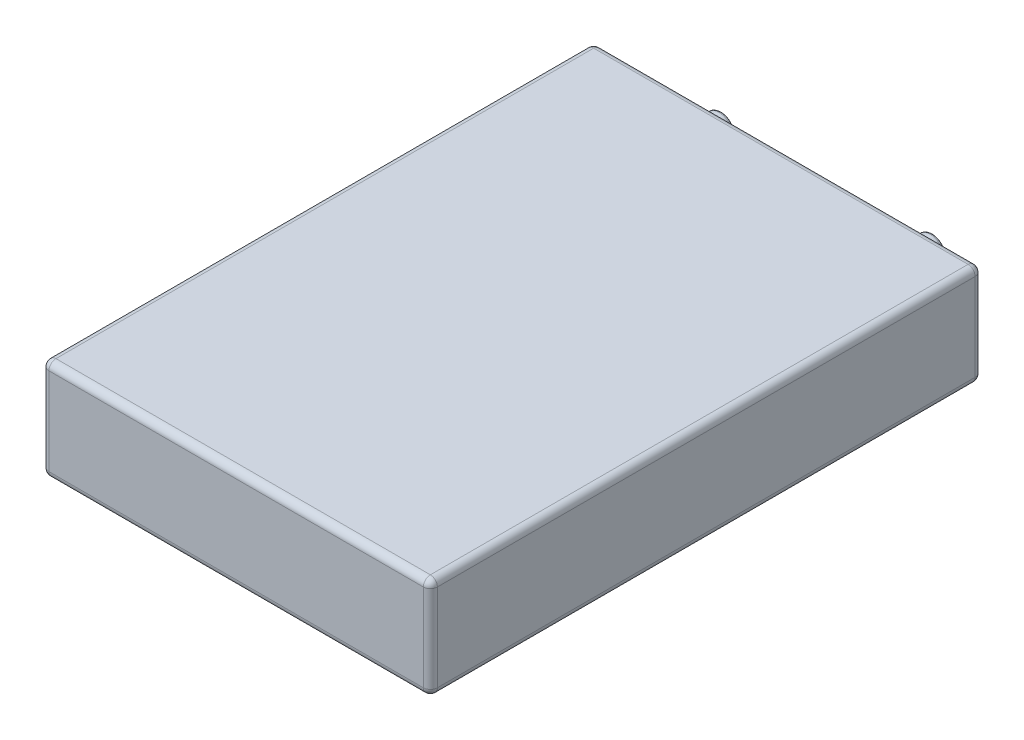
ISO-10303-21;
HEADER;
FILE_DESCRIPTION(('STEP AP214'),'2;1');
FILE_NAME('part.step','',(''),(''),'','','');
FILE_SCHEMA(('AUTOMOTIVE_DESIGN { 1 0 10303 214 1 1 1 1 }'));
ENDSEC;
DATA;
#1=APPLICATION_CONTEXT('core data for automotive mechanical design processes');
#2=APPLICATION_PROTOCOL_DEFINITION('international standard','automotive_design',2000,#1);
#3=PRODUCT_CONTEXT('',#1,'mechanical');
#4=PRODUCT('Part','Part','',(#3));
#5=PRODUCT_RELATED_PRODUCT_CATEGORY('part','',(#4));
#6=PRODUCT_DEFINITION_FORMATION('','',#4);
#7=PRODUCT_DEFINITION_CONTEXT('part definition',#1,'design');
#8=PRODUCT_DEFINITION('design','',#6,#7);
#9=PRODUCT_DEFINITION_SHAPE('','',#8);
#10=(LENGTH_UNIT() NAMED_UNIT(*) SI_UNIT(.MILLI.,.METRE.));
#11=(NAMED_UNIT(*) PLANE_ANGLE_UNIT() SI_UNIT($,.RADIAN.));
#12=(NAMED_UNIT(*) SI_UNIT($,.STERADIAN.) SOLID_ANGLE_UNIT());
#13=UNCERTAINTY_MEASURE_WITH_UNIT(LENGTH_MEASURE(1.E-05),#10,'distance_accuracy_value','');
#14=(GEOMETRIC_REPRESENTATION_CONTEXT(3) GLOBAL_UNCERTAINTY_ASSIGNED_CONTEXT((#13)) GLOBAL_UNIT_ASSIGNED_CONTEXT((#10,
#11,#12)) REPRESENTATION_CONTEXT('',''));
#15=CARTESIAN_POINT('',(0.,0.,0.));
#16=DIRECTION('',(0.,0.,1.));
#17=DIRECTION('',(1.,0.,0.));
#18=AXIS2_PLACEMENT_3D('',#15,#16,#17);
#19=CARTESIAN_POINT('',(-66.5,36.,95.5));
#20=DIRECTION('',(0.,-1.,0.));
#21=DIRECTION('',(0.,0.,-1.));
#22=AXIS2_PLACEMENT_3D('',#19,#20,#21);
#23=CYLINDRICAL_SURFACE('',#22,2.5);
#24=DIRECTION('',(0.,-1.,0.));
#25=VECTOR('',#24,1.);
#26=CARTESIAN_POINT('',(-69.,36.,95.5));
#27=LINE('',#26,#25);
#28=CARTESIAN_POINT('',(-69.,33.5,95.5));
#29=VERTEX_POINT('',#28);
#30=CARTESIAN_POINT('',(-69.,2.5,95.5));
#31=VERTEX_POINT('',#30);
#32=EDGE_CURVE('E229',#29,#31,#27,.T.);
#33=ORIENTED_EDGE('',*,*,#32,.T.);
#34=CARTESIAN_POINT('',(-66.5,2.5,95.5));
#35=DIRECTION('',(0.,-1.,0.));
#36=DIRECTION('',(0.,0.,-1.));
#37=AXIS2_PLACEMENT_3D('',#34,#35,#36);
#38=CIRCLE('',#37,2.5);
#39=CARTESIAN_POINT('',(-66.5,2.5,98.));
#40=VERTEX_POINT('',#39);
#41=EDGE_CURVE('E197',#31,#40,#38,.F.);
#42=ORIENTED_EDGE('',*,*,#41,.T.);
#43=DIRECTION('',(0.,-1.,0.));
#44=VECTOR('',#43,1.);
#45=CARTESIAN_POINT('',(-66.5,36.,98.));
#46=LINE('',#45,#44);
#47=CARTESIAN_POINT('',(-66.5,33.5,98.));
#48=VERTEX_POINT('',#47);
#49=EDGE_CURVE('E145',#48,#40,#46,.T.);
#50=ORIENTED_EDGE('',*,*,#49,.F.);
#51=CARTESIAN_POINT('',(-66.5,33.5,95.5));
#52=DIRECTION('',(0.,-1.,0.));
#53=DIRECTION('',(0.,0.,-1.));
#54=AXIS2_PLACEMENT_3D('',#51,#52,#53);
#55=CIRCLE('',#54,2.5);
#56=EDGE_CURVE('E195',#48,#29,#55,.T.);
#57=ORIENTED_EDGE('',*,*,#56,.T.);
#58=EDGE_LOOP('',(#33,#42,#50,#57));
#59=FACE_BOUND('',#58,.T.);
#60=ADVANCED_FACE('F33',(#59),#23,.T.);
#61=CARTESIAN_POINT('',(66.5,36.,98.));
#62=DIRECTION('',(0.,0.,-1.));
#63=DIRECTION('',(-1.,0.,0.));
#64=AXIS2_PLACEMENT_3D('',#61,#62,#63);
#65=PLANE('',#64);
#66=ORIENTED_EDGE('',*,*,#49,.T.);
#67=DIRECTION('',(1.,0.,0.));
#68=VECTOR('',#67,1.);
#69=CARTESIAN_POINT('',(66.5,2.5,98.));
#70=LINE('',#69,#68);
#71=CARTESIAN_POINT('',(66.5,2.5,98.));
#72=VERTEX_POINT('',#71);
#73=EDGE_CURVE('E144',#40,#72,#70,.T.);
#74=ORIENTED_EDGE('',*,*,#73,.T.);
#75=DIRECTION('',(0.,-1.,0.));
#76=VECTOR('',#75,1.);
#77=CARTESIAN_POINT('',(66.5,36.,98.));
#78=LINE('',#77,#76);
#79=CARTESIAN_POINT('',(66.5,33.5,98.));
#80=VERTEX_POINT('',#79);
#81=EDGE_CURVE('E126',#80,#72,#78,.T.);
#82=ORIENTED_EDGE('',*,*,#81,.F.);
#83=DIRECTION('',(1.,0.,0.));
#84=VECTOR('',#83,1.);
#85=CARTESIAN_POINT('',(66.5,33.5,98.));
#86=LINE('',#85,#84);
#87=EDGE_CURVE('E141',#80,#48,#86,.F.);
#88=ORIENTED_EDGE('',*,*,#87,.T.);
#89=EDGE_LOOP('',(#66,#74,#82,#88));
#90=FACE_BOUND('',#89,.T.);
#91=ADVANCED_FACE('F139',(#90),#65,.F.);
#92=CARTESIAN_POINT('',(66.5,36.,95.5));
#93=DIRECTION('',(0.,-1.,0.));
#94=DIRECTION('',(0.,0.,-1.));
#95=AXIS2_PLACEMENT_3D('',#92,#93,#94);
#96=CYLINDRICAL_SURFACE('',#95,2.5);
#97=ORIENTED_EDGE('',*,*,#81,.T.);
#98=CARTESIAN_POINT('',(66.5,2.5,95.5));
#99=DIRECTION('',(0.,-1.,0.));
#100=DIRECTION('',(0.,0.,-1.));
#101=AXIS2_PLACEMENT_3D('',#98,#99,#100);
#102=CIRCLE('',#101,2.5);
#103=CARTESIAN_POINT('',(69.,2.5,95.4999999999999));
#104=VERTEX_POINT('',#103);
#105=EDGE_CURVE('E133',#72,#104,#102,.F.);
#106=ORIENTED_EDGE('',*,*,#105,.T.);
#107=DIRECTION('',(0.,-1.,0.));
#108=VECTOR('',#107,1.);
#109=CARTESIAN_POINT('',(69.,36.,95.4999999999999));
#110=LINE('',#109,#108);
#111=CARTESIAN_POINT('',(69.,33.5,95.4999999999999));
#112=VERTEX_POINT('',#111);
#113=EDGE_CURVE('E128',#112,#104,#110,.T.);
#114=ORIENTED_EDGE('',*,*,#113,.F.);
#115=CARTESIAN_POINT('',(66.5,33.5,95.5));
#116=DIRECTION('',(0.,-1.,0.));
#117=DIRECTION('',(0.,0.,-1.));
#118=AXIS2_PLACEMENT_3D('',#115,#116,#117);
#119=CIRCLE('',#118,2.5);
#120=EDGE_CURVE('E123',#112,#80,#119,.T.);
#121=ORIENTED_EDGE('',*,*,#120,.T.);
#122=EDGE_LOOP('',(#97,#106,#114,#121));
#123=FACE_BOUND('',#122,.T.);
#124=ADVANCED_FACE('F125',(#123),#96,.T.);
#125=CARTESIAN_POINT('',(69.,36.,95.4999999999999));
#126=DIRECTION('',(-1.,0.,0.));
#127=DIRECTION('',(0.,0.,1.));
#128=AXIS2_PLACEMENT_3D('',#125,#126,#127);
#129=PLANE('',#128);
#130=ORIENTED_EDGE('',*,*,#113,.T.);
#131=DIRECTION('',(0.,0.,-1.));
#132=VECTOR('',#131,1.);
#133=CARTESIAN_POINT('',(69.,2.5,-95.5));
#134=LINE('',#133,#132);
#135=CARTESIAN_POINT('',(69.,2.5,-95.5));
#136=VERTEX_POINT('',#135);
#137=EDGE_CURVE('E176',#104,#136,#134,.T.);
#138=ORIENTED_EDGE('',*,*,#137,.T.);
#139=DIRECTION('',(0.,-1.,0.));
#140=VECTOR('',#139,1.);
#141=CARTESIAN_POINT('',(69.,36.,-95.5));
#142=LINE('',#141,#140);
#143=CARTESIAN_POINT('',(69.,33.5,-95.5));
#144=VERTEX_POINT('',#143);
#145=EDGE_CURVE('E645',#144,#136,#142,.T.);
#146=ORIENTED_EDGE('',*,*,#145,.F.);
#147=DIRECTION('',(0.,0.,-1.));
#148=VECTOR('',#147,1.);
#149=CARTESIAN_POINT('',(69.,33.5,95.4999999999999));
#150=LINE('',#149,#148);
#151=EDGE_CURVE('E174',#144,#112,#150,.F.);
#152=ORIENTED_EDGE('',*,*,#151,.T.);
#153=EDGE_LOOP('',(#130,#138,#146,#152));
#154=FACE_BOUND('',#153,.T.);
#155=ADVANCED_FACE('F416',(#154),#129,.F.);
#156=CARTESIAN_POINT('',(66.5,36.,-95.5));
#157=DIRECTION('',(0.,-1.,0.));
#158=DIRECTION('',(0.,0.,-1.));
#159=AXIS2_PLACEMENT_3D('',#156,#157,#158);
#160=CYLINDRICAL_SURFACE('',#159,2.5);
#161=ORIENTED_EDGE('',*,*,#145,.T.);
#162=CARTESIAN_POINT('',(66.5,2.5,-95.5));
#163=DIRECTION('',(0.,-1.,0.));
#164=DIRECTION('',(0.,0.,-1.));
#165=AXIS2_PLACEMENT_3D('',#162,#163,#164);
#166=CIRCLE('',#165,2.5);
#167=CARTESIAN_POINT('',(66.5,2.5,-98.));
#168=VERTEX_POINT('',#167);
#169=EDGE_CURVE('E180',#136,#168,#166,.F.);
#170=ORIENTED_EDGE('',*,*,#169,.T.);
#171=DIRECTION('',(0.,-1.,0.));
#172=VECTOR('',#171,1.);
#173=CARTESIAN_POINT('',(66.5,36.,-98.));
#174=LINE('',#173,#172);
#175=CARTESIAN_POINT('',(66.5,33.5,-98.));
#176=VERTEX_POINT('',#175);
#177=EDGE_CURVE('E662',#176,#168,#174,.T.);
#178=ORIENTED_EDGE('',*,*,#177,.F.);
#179=CARTESIAN_POINT('',(66.5,33.5,-95.5));
#180=DIRECTION('',(0.,-1.,0.));
#181=DIRECTION('',(0.,0.,-1.));
#182=AXIS2_PLACEMENT_3D('',#179,#180,#181);
#183=CIRCLE('',#182,2.5);
#184=EDGE_CURVE('E178',#176,#144,#183,.T.);
#185=ORIENTED_EDGE('',*,*,#184,.T.);
#186=EDGE_LOOP('',(#161,#170,#178,#185));
#187=FACE_BOUND('',#186,.T.);
#188=ADVANCED_FACE('F412',(#187),#160,.T.);
#189=CARTESIAN_POINT('',(66.5,36.,-98.));
#190=DIRECTION('',(0.,0.,1.));
#191=DIRECTION('',(1.,0.,0.));
#192=AXIS2_PLACEMENT_3D('',#189,#190,#191);
#193=PLANE('',#192);
#194=CARTESIAN_POINT('',(-37.5,18.,-98.));
#195=DIRECTION('',(0.,0.,1.));
#196=DIRECTION('',(1.,0.,0.));
#197=AXIS2_PLACEMENT_3D('',#194,#195,#196);
#198=CIRCLE('',#197,10.);
#199=CARTESIAN_POINT('',(-27.5,18.,-98.));
#200=VERTEX_POINT('',#199);
#201=EDGE_CURVE('E244',#200,#200,#198,.F.);
#202=ORIENTED_EDGE('',*,*,#201,.F.);
#203=EDGE_LOOP('',(#202));
#204=FACE_BOUND('',#203,.T.);
#205=CARTESIAN_POINT('',(37.5,18.,-98.));
#206=DIRECTION('',(0.,0.,1.));
#207=DIRECTION('',(1.,0.,0.));
#208=AXIS2_PLACEMENT_3D('',#205,#206,#207);
#209=CIRCLE('',#208,10.);
#210=CARTESIAN_POINT('',(47.5,18.,-98.));
#211=VERTEX_POINT('',#210);
#212=EDGE_CURVE('E205',#211,#211,#209,.F.);
#213=ORIENTED_EDGE('',*,*,#212,.F.);
#214=EDGE_LOOP('',(#213));
#215=FACE_BOUND('',#214,.T.);
#216=ORIENTED_EDGE('',*,*,#177,.T.);
#217=DIRECTION('',(-1.,0.,0.));
#218=VECTOR('',#217,1.);
#219=CARTESIAN_POINT('',(-66.5,2.5,-98.));
#220=LINE('',#219,#218);
#221=CARTESIAN_POINT('',(-66.5,2.5,-98.));
#222=VERTEX_POINT('',#221);
#223=EDGE_CURVE('E184',#168,#222,#220,.T.);
#224=ORIENTED_EDGE('',*,*,#223,.T.);
#225=DIRECTION('',(0.,-1.,0.));
#226=VECTOR('',#225,1.);
#227=CARTESIAN_POINT('',(-66.5,36.,-98.));
#228=LINE('',#227,#226);
#229=CARTESIAN_POINT('',(-66.5,33.5,-98.));
#230=VERTEX_POINT('',#229);
#231=EDGE_CURVE('E668',#230,#222,#228,.T.);
#232=ORIENTED_EDGE('',*,*,#231,.F.);
#233=DIRECTION('',(-1.,0.,0.));
#234=VECTOR('',#233,1.);
#235=CARTESIAN_POINT('',(66.5,33.5,-98.));
#236=LINE('',#235,#234);
#237=EDGE_CURVE('E182',#230,#176,#236,.F.);
#238=ORIENTED_EDGE('',*,*,#237,.T.);
#239=EDGE_LOOP('',(#216,#224,#232,#238));
#240=FACE_BOUND('',#239,.T.);
#241=ADVANCED_FACE('F408',(#204,#215,#240),#193,.F.);
#242=CARTESIAN_POINT('',(-66.5,36.,-95.5));
#243=DIRECTION('',(0.,-1.,0.));
#244=DIRECTION('',(0.,0.,-1.));
#245=AXIS2_PLACEMENT_3D('',#242,#243,#244);
#246=CYLINDRICAL_SURFACE('',#245,2.5);
#247=ORIENTED_EDGE('',*,*,#231,.T.);
#248=CARTESIAN_POINT('',(-66.5,2.5,-95.5));
#249=DIRECTION('',(0.,-1.,0.));
#250=DIRECTION('',(0.,0.,-1.));
#251=AXIS2_PLACEMENT_3D('',#248,#249,#250);
#252=CIRCLE('',#251,2.5);
#253=CARTESIAN_POINT('',(-69.,2.5,-95.5));
#254=VERTEX_POINT('',#253);
#255=EDGE_CURVE('E188',#222,#254,#252,.F.);
#256=ORIENTED_EDGE('',*,*,#255,.T.);
#257=DIRECTION('',(0.,-1.,0.));
#258=VECTOR('',#257,1.);
#259=CARTESIAN_POINT('',(-69.,36.,-95.5));
#260=LINE('',#259,#258);
#261=CARTESIAN_POINT('',(-69.,33.5,-95.5));
#262=VERTEX_POINT('',#261);
#263=EDGE_CURVE('E671',#262,#254,#260,.T.);
#264=ORIENTED_EDGE('',*,*,#263,.F.);
#265=CARTESIAN_POINT('',(-66.5,33.5,-95.5));
#266=DIRECTION('',(0.,-1.,0.));
#267=DIRECTION('',(0.,0.,-1.));
#268=AXIS2_PLACEMENT_3D('',#265,#266,#267);
#269=CIRCLE('',#268,2.5);
#270=EDGE_CURVE('E186',#262,#230,#269,.T.);
#271=ORIENTED_EDGE('',*,*,#270,.T.);
#272=EDGE_LOOP('',(#247,#256,#264,#271));
#273=FACE_BOUND('',#272,.T.);
#274=ADVANCED_FACE('F404',(#273),#246,.T.);
#275=CARTESIAN_POINT('',(-69.,36.,95.5));
#276=DIRECTION('',(1.,0.,0.));
#277=DIRECTION('',(0.,0.,-1.));
#278=AXIS2_PLACEMENT_3D('',#275,#276,#277);
#279=PLANE('',#278);
#280=ORIENTED_EDGE('',*,*,#263,.T.);
#281=DIRECTION('',(0.,0.,1.));
#282=VECTOR('',#281,1.);
#283=CARTESIAN_POINT('',(-69.,2.5,95.5));
#284=LINE('',#283,#282);
#285=EDGE_CURVE('E193',#254,#31,#284,.T.);
#286=ORIENTED_EDGE('',*,*,#285,.T.);
#287=ORIENTED_EDGE('',*,*,#32,.F.);
#288=DIRECTION('',(0.,0.,1.));
#289=VECTOR('',#288,1.);
#290=CARTESIAN_POINT('',(-69.,33.5,95.5));
#291=LINE('',#290,#289);
#292=EDGE_CURVE('E190',#29,#262,#291,.F.);
#293=ORIENTED_EDGE('',*,*,#292,.T.);
#294=EDGE_LOOP('',(#280,#286,#287,#293));
#295=FACE_BOUND('',#294,.T.);
#296=ADVANCED_FACE('F398',(#295),#279,.F.);
#297=CARTESIAN_POINT('',(-66.5,36.,95.5));
#298=DIRECTION('',(0.,-1.,0.));
#299=DIRECTION('',(0.,0.,-1.));
#300=AXIS2_PLACEMENT_3D('',#297,#298,#299);
#301=PLANE('',#300);
#302=DIRECTION('',(-1.,0.,0.));
#303=VECTOR('',#302,1.);
#304=CARTESIAN_POINT('',(-66.5000000000001,36.,-95.5));
#305=LINE('',#304,#303);
#306=CARTESIAN_POINT('',(66.5,36.,-95.5));
#307=VERTEX_POINT('',#306);
#308=CARTESIAN_POINT('',(-66.5,36.,-95.5));
#309=VERTEX_POINT('',#308);
#310=EDGE_CURVE('E48',#307,#309,#305,.T.);
#311=ORIENTED_EDGE('',*,*,#310,.T.);
#312=DIRECTION('',(0.,0.,1.));
#313=VECTOR('',#312,1.);
#314=CARTESIAN_POINT('',(-66.5,36.,95.5));
#315=LINE('',#314,#313);
#316=CARTESIAN_POINT('',(-66.5,36.,95.5));
#317=VERTEX_POINT('',#316);
#318=EDGE_CURVE('E203',#309,#317,#315,.T.);
#319=ORIENTED_EDGE('',*,*,#318,.T.);
#320=DIRECTION('',(1.,0.,0.));
#321=VECTOR('',#320,1.);
#322=CARTESIAN_POINT('',(-66.5,36.,95.5));
#323=LINE('',#322,#321);
#324=CARTESIAN_POINT('',(66.5,36.,95.5));
#325=VERTEX_POINT('',#324);
#326=EDGE_CURVE('E199',#317,#325,#323,.T.);
#327=ORIENTED_EDGE('',*,*,#326,.T.);
#328=DIRECTION('',(0.,0.,-1.));
#329=VECTOR('',#328,1.);
#330=CARTESIAN_POINT('',(66.5,36.,95.5));
#331=LINE('',#330,#329);
#332=EDGE_CURVE('E53',#325,#307,#331,.T.);
#333=ORIENTED_EDGE('',*,*,#332,.T.);
#334=EDGE_LOOP('',(#311,#319,#327,#333));
#335=FACE_BOUND('',#334,.T.);
#336=ADVANCED_FACE('F395',(#335),#301,.F.);
#337=CARTESIAN_POINT('',(-66.5,0.,95.5));
#338=DIRECTION('',(0.,-1.,0.));
#339=DIRECTION('',(0.,0.,-1.));
#340=AXIS2_PLACEMENT_3D('',#337,#338,#339);
#341=PLANE('',#340);
#342=DIRECTION('',(0.,0.,-1.));
#343=VECTOR('',#342,1.);
#344=CARTESIAN_POINT('',(66.5,0.,95.4999999999999));
#345=LINE('',#344,#343);
#346=CARTESIAN_POINT('',(66.5,0.,-95.5));
#347=VERTEX_POINT('',#346);
#348=CARTESIAN_POINT('',(66.5,0.,95.5));
#349=VERTEX_POINT('',#348);
#350=EDGE_CURVE('E169',#347,#349,#345,.F.);
#351=ORIENTED_EDGE('',*,*,#350,.T.);
#352=DIRECTION('',(1.,0.,0.));
#353=VECTOR('',#352,1.);
#354=CARTESIAN_POINT('',(-66.5,0.,95.5));
#355=LINE('',#354,#353);
#356=CARTESIAN_POINT('',(-66.5,0.,95.5));
#357=VERTEX_POINT('',#356);
#358=EDGE_CURVE('E134',#349,#357,#355,.F.);
#359=ORIENTED_EDGE('',*,*,#358,.T.);
#360=DIRECTION('',(0.,0.,1.));
#361=VECTOR('',#360,1.);
#362=CARTESIAN_POINT('',(-66.5,0.,-95.5));
#363=LINE('',#362,#361);
#364=CARTESIAN_POINT('',(-66.5,0.,-95.5));
#365=VERTEX_POINT('',#364);
#366=EDGE_CURVE('E162',#357,#365,#363,.F.);
#367=ORIENTED_EDGE('',*,*,#366,.T.);
#368=DIRECTION('',(-1.,0.,0.));
#369=VECTOR('',#368,1.);
#370=CARTESIAN_POINT('',(66.5,0.,-95.5));
#371=LINE('',#370,#369);
#372=EDGE_CURVE('E167',#365,#347,#371,.F.);
#373=ORIENTED_EDGE('',*,*,#372,.T.);
#374=EDGE_LOOP('',(#351,#359,#367,#373));
#375=FACE_BOUND('',#374,.T.);
#376=ADVANCED_FACE('F322',(#375),#341,.T.);
#377=CARTESIAN_POINT('',(66.5,2.5,-95.5));
#378=DIRECTION('',(1.,0.,0.));
#379=DIRECTION('',(0.,0.,-1.));
#380=AXIS2_PLACEMENT_3D('',#377,#378,#379);
#381=CYLINDRICAL_SURFACE('',#380,2.5);
#382=CARTESIAN_POINT('',(-66.5,2.5,-95.5));
#383=DIRECTION('',(-1.,0.,0.));
#384=DIRECTION('',(0.,0.,1.));
#385=AXIS2_PLACEMENT_3D('',#382,#383,#384);
#386=CIRCLE('',#385,2.5);
#387=EDGE_CURVE('E226',#222,#365,#386,.T.);
#388=ORIENTED_EDGE('',*,*,#387,.F.);
#389=ORIENTED_EDGE('',*,*,#223,.F.);
#390=CARTESIAN_POINT('',(66.5,2.5,-95.5));
#391=DIRECTION('',(1.,0.,0.));
#392=DIRECTION('',(0.,0.,-1.));
#393=AXIS2_PLACEMENT_3D('',#390,#391,#392);
#394=CIRCLE('',#393,2.5);
#395=EDGE_CURVE('E223',#347,#168,#394,.T.);
#396=ORIENTED_EDGE('',*,*,#395,.F.);
#397=ORIENTED_EDGE('',*,*,#372,.F.);
#398=EDGE_LOOP('',(#388,#389,#396,#397));
#399=FACE_BOUND('',#398,.T.);
#400=ADVANCED_FACE('F318',(#399),#381,.T.);
#401=CARTESIAN_POINT('',(-66.5,2.5,-95.5));
#402=DIRECTION('',(0.,-1.,0.));
#403=DIRECTION('',(0.,0.,-1.));
#404=AXIS2_PLACEMENT_3D('',#401,#402,#403);
#405=SPHERICAL_SURFACE('',#404,2.5);
#406=ORIENTED_EDGE('',*,*,#255,.F.);
#407=ORIENTED_EDGE('',*,*,#387,.T.);
#408=CARTESIAN_POINT('',(-66.5,2.5,-95.5));
#409=DIRECTION('',(0.,0.,1.));
#410=DIRECTION('',(1.,0.,0.));
#411=AXIS2_PLACEMENT_3D('',#408,#409,#410);
#412=CIRCLE('',#411,2.5);
#413=EDGE_CURVE('E220',#254,#365,#412,.T.);
#414=ORIENTED_EDGE('',*,*,#413,.F.);
#415=EDGE_LOOP('',(#406,#407,#414));
#416=FACE_BOUND('',#415,.T.);
#417=ADVANCED_FACE('F314',(#416),#405,.T.);
#418=CARTESIAN_POINT('',(66.5,2.5,-95.5));
#419=DIRECTION('',(0.,-1.,0.));
#420=DIRECTION('',(0.,0.,-1.));
#421=AXIS2_PLACEMENT_3D('',#418,#419,#420);
#422=SPHERICAL_SURFACE('',#421,2.5);
#423=ORIENTED_EDGE('',*,*,#395,.T.);
#424=ORIENTED_EDGE('',*,*,#169,.F.);
#425=CARTESIAN_POINT('',(66.5,2.5,-95.5));
#426=DIRECTION('',(0.,0.,1.));
#427=DIRECTION('',(1.,0.,0.));
#428=AXIS2_PLACEMENT_3D('',#425,#426,#427);
#429=CIRCLE('',#428,2.5);
#430=EDGE_CURVE('E217',#347,#136,#429,.T.);
#431=ORIENTED_EDGE('',*,*,#430,.F.);
#432=EDGE_LOOP('',(#423,#424,#431));
#433=FACE_BOUND('',#432,.T.);
#434=ADVANCED_FACE('F310',(#433),#422,.T.);
#435=CARTESIAN_POINT('',(-66.5,2.5,95.5));
#436=DIRECTION('',(0.,0.,-1.));
#437=DIRECTION('',(-1.,0.,0.));
#438=AXIS2_PLACEMENT_3D('',#435,#436,#437);
#439=CYLINDRICAL_SURFACE('',#438,2.5);
#440=ORIENTED_EDGE('',*,*,#413,.T.);
#441=ORIENTED_EDGE('',*,*,#366,.F.);
#442=CARTESIAN_POINT('',(-66.5,2.5,95.5));
#443=DIRECTION('',(0.,0.,1.));
#444=DIRECTION('',(1.,0.,0.));
#445=AXIS2_PLACEMENT_3D('',#442,#443,#444);
#446=CIRCLE('',#445,2.5);
#447=EDGE_CURVE('E214',#31,#357,#446,.T.);
#448=ORIENTED_EDGE('',*,*,#447,.F.);
#449=ORIENTED_EDGE('',*,*,#285,.F.);
#450=EDGE_LOOP('',(#440,#441,#448,#449));
#451=FACE_BOUND('',#450,.T.);
#452=ADVANCED_FACE('F306',(#451),#439,.T.);
#453=CARTESIAN_POINT('',(66.5,2.5,95.4999999999999));
#454=DIRECTION('',(0.,0.,1.));
#455=DIRECTION('',(1.,0.,0.));
#456=AXIS2_PLACEMENT_3D('',#453,#454,#455);
#457=CYLINDRICAL_SURFACE('',#456,2.5);
#458=ORIENTED_EDGE('',*,*,#430,.T.);
#459=ORIENTED_EDGE('',*,*,#137,.F.);
#460=CARTESIAN_POINT('',(66.5,2.5,95.5));
#461=DIRECTION('',(0.,0.,1.));
#462=DIRECTION('',(1.,0.,0.));
#463=AXIS2_PLACEMENT_3D('',#460,#461,#462);
#464=CIRCLE('',#463,2.5);
#465=EDGE_CURVE('E211',#349,#104,#464,.T.);
#466=ORIENTED_EDGE('',*,*,#465,.F.);
#467=ORIENTED_EDGE('',*,*,#350,.F.);
#468=EDGE_LOOP('',(#458,#459,#466,#467));
#469=FACE_BOUND('',#468,.T.);
#470=ADVANCED_FACE('F302',(#469),#457,.T.);
#471=CARTESIAN_POINT('',(-66.5,2.5,95.5));
#472=DIRECTION('',(0.,-1.,0.));
#473=DIRECTION('',(0.,0.,-1.));
#474=AXIS2_PLACEMENT_3D('',#471,#472,#473);
#475=SPHERICAL_SURFACE('',#474,2.5);
#476=ORIENTED_EDGE('',*,*,#41,.F.);
#477=ORIENTED_EDGE('',*,*,#447,.T.);
#478=CARTESIAN_POINT('',(-66.5,2.5,95.5));
#479=DIRECTION('',(1.,0.,0.));
#480=DIRECTION('',(0.,0.,-1.));
#481=AXIS2_PLACEMENT_3D('',#478,#479,#480);
#482=CIRCLE('',#481,2.5);
#483=EDGE_CURVE('E208',#40,#357,#482,.T.);
#484=ORIENTED_EDGE('',*,*,#483,.F.);
#485=EDGE_LOOP('',(#476,#477,#484));
#486=FACE_BOUND('',#485,.T.);
#487=ADVANCED_FACE('F298',(#486),#475,.T.);
#488=CARTESIAN_POINT('',(66.5,2.5,95.5));
#489=DIRECTION('',(0.,-1.,0.));
#490=DIRECTION('',(0.,0.,-1.));
#491=AXIS2_PLACEMENT_3D('',#488,#489,#490);
#492=SPHERICAL_SURFACE('',#491,2.5);
#493=ORIENTED_EDGE('',*,*,#465,.T.);
#494=ORIENTED_EDGE('',*,*,#105,.F.);
#495=CARTESIAN_POINT('',(66.5,2.5,95.5));
#496=DIRECTION('',(-1.,0.,0.));
#497=DIRECTION('',(0.,0.,1.));
#498=AXIS2_PLACEMENT_3D('',#495,#496,#497);
#499=CIRCLE('',#498,2.5);
#500=EDGE_CURVE('E206',#349,#72,#499,.T.);
#501=ORIENTED_EDGE('',*,*,#500,.F.);
#502=EDGE_LOOP('',(#493,#494,#501));
#503=FACE_BOUND('',#502,.T.);
#504=ADVANCED_FACE('F294',(#503),#492,.T.);
#505=CARTESIAN_POINT('',(66.5,2.5,95.5));
#506=DIRECTION('',(-1.,0.,0.));
#507=DIRECTION('',(0.,0.,1.));
#508=AXIS2_PLACEMENT_3D('',#505,#506,#507);
#509=CYLINDRICAL_SURFACE('',#508,2.5);
#510=ORIENTED_EDGE('',*,*,#483,.T.);
#511=ORIENTED_EDGE('',*,*,#358,.F.);
#512=ORIENTED_EDGE('',*,*,#500,.T.);
#513=ORIENTED_EDGE('',*,*,#73,.F.);
#514=EDGE_LOOP('',(#510,#511,#512,#513));
#515=FACE_BOUND('',#514,.T.);
#516=ADVANCED_FACE('F290',(#515),#509,.T.);
#517=CARTESIAN_POINT('',(66.5,33.5,95.5));
#518=DIRECTION('',(0.,0.,-1.));
#519=DIRECTION('',(-1.,0.,0.));
#520=AXIS2_PLACEMENT_3D('',#517,#518,#519);
#521=CYLINDRICAL_SURFACE('',#520,2.5);
#522=CARTESIAN_POINT('',(66.5,33.5,95.4999999999999));
#523=DIRECTION('',(0.,0.,1.));
#524=DIRECTION('',(1.,0.,0.));
#525=AXIS2_PLACEMENT_3D('',#522,#523,#524);
#526=CIRCLE('',#525,2.5);
#527=EDGE_CURVE('E150',#112,#325,#526,.T.);
#528=ORIENTED_EDGE('',*,*,#527,.F.);
#529=ORIENTED_EDGE('',*,*,#151,.F.);
#530=CARTESIAN_POINT('',(66.5,33.5,-95.5));
#531=DIRECTION('',(0.,0.,-1.));
#532=DIRECTION('',(-1.,0.,0.));
#533=AXIS2_PLACEMENT_3D('',#530,#531,#532);
#534=CIRCLE('',#533,2.5);
#535=EDGE_CURVE('E209',#307,#144,#534,.T.);
#536=ORIENTED_EDGE('',*,*,#535,.F.);
#537=ORIENTED_EDGE('',*,*,#332,.F.);
#538=EDGE_LOOP('',(#528,#529,#536,#537));
#539=FACE_BOUND('',#538,.T.);
#540=ADVANCED_FACE('F293',(#539),#521,.T.);
#541=CARTESIAN_POINT('',(66.5,33.5,-95.5));
#542=DIRECTION('',(0.,-1.,0.));
#543=DIRECTION('',(0.,0.,-1.));
#544=AXIS2_PLACEMENT_3D('',#541,#542,#543);
#545=SPHERICAL_SURFACE('',#544,2.5);
#546=ORIENTED_EDGE('',*,*,#535,.T.);
#547=ORIENTED_EDGE('',*,*,#184,.F.);
#548=CARTESIAN_POINT('',(66.5,33.5,-95.5));
#549=DIRECTION('',(-1.,0.,0.));
#550=DIRECTION('',(0.,0.,1.));
#551=AXIS2_PLACEMENT_3D('',#548,#549,#550);
#552=CIRCLE('',#551,2.5);
#553=EDGE_CURVE('E153',#307,#176,#552,.T.);
#554=ORIENTED_EDGE('',*,*,#553,.F.);
#555=EDGE_LOOP('',(#546,#547,#554));
#556=FACE_BOUND('',#555,.T.);
#557=ADVANCED_FACE('F345',(#556),#545,.T.);
#558=CARTESIAN_POINT('',(66.5,33.5,95.5));
#559=DIRECTION('',(0.,-1.,0.));
#560=DIRECTION('',(0.,0.,-1.));
#561=AXIS2_PLACEMENT_3D('',#558,#559,#560);
#562=SPHERICAL_SURFACE('',#561,2.5);
#563=ORIENTED_EDGE('',*,*,#120,.F.);
#564=ORIENTED_EDGE('',*,*,#527,.T.);
#565=CARTESIAN_POINT('',(66.5,33.5,95.5));
#566=DIRECTION('',(-1.,0.,0.));
#567=DIRECTION('',(0.,0.,1.));
#568=AXIS2_PLACEMENT_3D('',#565,#566,#567);
#569=CIRCLE('',#568,2.5);
#570=EDGE_CURVE('E148',#80,#325,#569,.T.);
#571=ORIENTED_EDGE('',*,*,#570,.F.);
#572=EDGE_LOOP('',(#563,#564,#571));
#573=FACE_BOUND('',#572,.T.);
#574=ADVANCED_FACE('F149',(#573),#562,.T.);
#575=CARTESIAN_POINT('',(-66.5000000000001,33.5,-95.5));
#576=DIRECTION('',(-1.,0.,0.));
#577=DIRECTION('',(0.,0.,1.));
#578=AXIS2_PLACEMENT_3D('',#575,#576,#577);
#579=CYLINDRICAL_SURFACE('',#578,2.5);
#580=ORIENTED_EDGE('',*,*,#553,.T.);
#581=ORIENTED_EDGE('',*,*,#237,.F.);
#582=CARTESIAN_POINT('',(-66.5,33.5,-95.5));
#583=DIRECTION('',(-1.,0.,0.));
#584=DIRECTION('',(0.,0.,1.));
#585=AXIS2_PLACEMENT_3D('',#582,#583,#584);
#586=CIRCLE('',#585,2.5);
#587=EDGE_CURVE('E154',#309,#230,#586,.T.);
#588=ORIENTED_EDGE('',*,*,#587,.F.);
#589=ORIENTED_EDGE('',*,*,#310,.F.);
#590=EDGE_LOOP('',(#580,#581,#588,#589));
#591=FACE_BOUND('',#590,.T.);
#592=ADVANCED_FACE('F339',(#591),#579,.T.);
#593=CARTESIAN_POINT('',(-66.5,33.5,95.5));
#594=DIRECTION('',(1.,0.,0.));
#595=DIRECTION('',(0.,0.,-1.));
#596=AXIS2_PLACEMENT_3D('',#593,#594,#595);
#597=CYLINDRICAL_SURFACE('',#596,2.5);
#598=ORIENTED_EDGE('',*,*,#570,.T.);
#599=ORIENTED_EDGE('',*,*,#326,.F.);
#600=CARTESIAN_POINT('',(-66.5,33.5,95.5));
#601=DIRECTION('',(-1.,0.,0.));
#602=DIRECTION('',(0.,0.,1.));
#603=AXIS2_PLACEMENT_3D('',#600,#601,#602);
#604=CIRCLE('',#603,2.5);
#605=EDGE_CURVE('E159',#48,#317,#604,.T.);
#606=ORIENTED_EDGE('',*,*,#605,.F.);
#607=ORIENTED_EDGE('',*,*,#87,.F.);
#608=EDGE_LOOP('',(#598,#599,#606,#607));
#609=FACE_BOUND('',#608,.T.);
#610=ADVANCED_FACE('F157',(#609),#597,.T.);
#611=CARTESIAN_POINT('',(-66.5,33.5,-95.5));
#612=DIRECTION('',(0.,-1.,0.));
#613=DIRECTION('',(0.,0.,-1.));
#614=AXIS2_PLACEMENT_3D('',#611,#612,#613);
#615=SPHERICAL_SURFACE('',#614,2.5);
#616=ORIENTED_EDGE('',*,*,#587,.T.);
#617=ORIENTED_EDGE('',*,*,#270,.F.);
#618=CARTESIAN_POINT('',(-66.5,33.5,-95.5));
#619=DIRECTION('',(0.,0.,1.));
#620=DIRECTION('',(1.,0.,0.));
#621=AXIS2_PLACEMENT_3D('',#618,#619,#620);
#622=CIRCLE('',#621,2.5);
#623=EDGE_CURVE('E232',#309,#262,#622,.T.);
#624=ORIENTED_EDGE('',*,*,#623,.F.);
#625=EDGE_LOOP('',(#616,#617,#624));
#626=FACE_BOUND('',#625,.T.);
#627=ADVANCED_FACE('F332',(#626),#615,.T.);
#628=CARTESIAN_POINT('',(-66.5,33.5,95.5));
#629=DIRECTION('',(0.,-1.,0.));
#630=DIRECTION('',(0.,0.,-1.));
#631=AXIS2_PLACEMENT_3D('',#628,#629,#630);
#632=SPHERICAL_SURFACE('',#631,2.5);
#633=ORIENTED_EDGE('',*,*,#56,.F.);
#634=ORIENTED_EDGE('',*,*,#605,.T.);
#635=CARTESIAN_POINT('',(-66.5,33.5,95.5));
#636=DIRECTION('',(0.,0.,-1.));
#637=DIRECTION('',(-1.,0.,0.));
#638=AXIS2_PLACEMENT_3D('',#635,#636,#637);
#639=CIRCLE('',#638,2.5);
#640=EDGE_CURVE('E230',#29,#317,#639,.T.);
#641=ORIENTED_EDGE('',*,*,#640,.F.);
#642=EDGE_LOOP('',(#633,#634,#641));
#643=FACE_BOUND('',#642,.T.);
#644=ADVANCED_FACE('F328',(#643),#632,.T.);
#645=CARTESIAN_POINT('',(-66.5,33.5,95.5));
#646=DIRECTION('',(0.,0.,1.));
#647=DIRECTION('',(1.,0.,0.));
#648=AXIS2_PLACEMENT_3D('',#645,#646,#647);
#649=CYLINDRICAL_SURFACE('',#648,2.5);
#650=ORIENTED_EDGE('',*,*,#623,.T.);
#651=ORIENTED_EDGE('',*,*,#292,.F.);
#652=ORIENTED_EDGE('',*,*,#640,.T.);
#653=ORIENTED_EDGE('',*,*,#318,.F.);
#654=EDGE_LOOP('',(#650,#651,#652,#653));
#655=FACE_BOUND('',#654,.T.);
#656=ADVANCED_FACE('F324',(#655),#649,.T.);
#657=CARTESIAN_POINT('',(37.5,18.,-102.));
#658=DIRECTION('',(0.,0.,1.));
#659=DIRECTION('',(1.,0.,0.));
#660=AXIS2_PLACEMENT_3D('',#657,#658,#659);
#661=CYLINDRICAL_SURFACE('',#660,10.);
#662=CARTESIAN_POINT('',(37.5,18.,-101.));
#663=DIRECTION('',(0.,0.,-1.));
#664=DIRECTION('',(-1.,0.,0.));
#665=AXIS2_PLACEMENT_3D('',#662,#663,#664);
#666=CIRCLE('',#665,10.);
#667=CARTESIAN_POINT('',(27.5,18.,-101.));
#668=VERTEX_POINT('',#667);
#669=EDGE_CURVE('E264',#668,#668,#666,.F.);
#670=ORIENTED_EDGE('',*,*,#669,.T.);
#671=EDGE_LOOP('',(#670));
#672=FACE_BOUND('',#671,.T.);
#673=ORIENTED_EDGE('',*,*,#212,.T.);
#674=EDGE_LOOP('',(#673));
#675=FACE_BOUND('',#674,.T.);
#676=ADVANCED_FACE('F327',(#672,#675),#661,.T.);
#677=CARTESIAN_POINT('',(37.5,18.,-102.));
#678=DIRECTION('',(0.,0.,-1.));
#679=DIRECTION('',(-1.,0.,0.));
#680=AXIS2_PLACEMENT_3D('',#677,#678,#679);
#681=PLANE('',#680);
#682=CARTESIAN_POINT('',(37.5,18.,-102.));
#683=DIRECTION('',(0.,0.,-1.));
#684=DIRECTION('',(-1.,0.,0.));
#685=AXIS2_PLACEMENT_3D('',#682,#683,#684);
#686=CIRCLE('',#685,9.);
#687=CARTESIAN_POINT('',(28.5,18.,-102.));
#688=VERTEX_POINT('',#687);
#689=EDGE_CURVE('E261',#688,#688,#686,.T.);
#690=ORIENTED_EDGE('',*,*,#689,.T.);
#691=EDGE_LOOP('',(#690));
#692=FACE_BOUND('',#691,.T.);
#693=CARTESIAN_POINT('',(37.5,18.,-102.));
#694=DIRECTION('',(0.,0.,-1.));
#695=DIRECTION('',(-1.,0.,0.));
#696=AXIS2_PLACEMENT_3D('',#693,#694,#695);
#697=CIRCLE('',#696,5.);
#698=CARTESIAN_POINT('',(32.5,18.,-102.));
#699=VERTEX_POINT('',#698);
#700=EDGE_CURVE('E247',#699,#699,#697,.T.);
#701=ORIENTED_EDGE('',*,*,#700,.F.);
#702=EDGE_LOOP('',(#701));
#703=FACE_BOUND('',#702,.T.);
#704=ADVANCED_FACE('F387',(#692,#703),#681,.T.);
#705=CARTESIAN_POINT('',(-37.5,18.,-102.));
#706=DIRECTION('',(0.,0.,1.));
#707=DIRECTION('',(1.,0.,0.));
#708=AXIS2_PLACEMENT_3D('',#705,#706,#707);
#709=CYLINDRICAL_SURFACE('',#708,10.);
#710=CARTESIAN_POINT('',(-37.5,18.,-101.));
#711=DIRECTION('',(0.,0.,-1.));
#712=DIRECTION('',(-1.,0.,0.));
#713=AXIS2_PLACEMENT_3D('',#710,#711,#712);
#714=CIRCLE('',#713,10.);
#715=CARTESIAN_POINT('',(-47.5,18.,-101.));
#716=VERTEX_POINT('',#715);
#717=EDGE_CURVE('E251',#716,#716,#714,.F.);
#718=ORIENTED_EDGE('',*,*,#717,.T.);
#719=EDGE_LOOP('',(#718));
#720=FACE_BOUND('',#719,.T.);
#721=ORIENTED_EDGE('',*,*,#201,.T.);
#722=EDGE_LOOP('',(#721));
#723=FACE_BOUND('',#722,.T.);
#724=ADVANCED_FACE('F383',(#720,#723),#709,.T.);
#725=CARTESIAN_POINT('',(-37.5,18.,-102.));
#726=DIRECTION('',(0.,0.,-1.));
#727=DIRECTION('',(-1.,0.,0.));
#728=AXIS2_PLACEMENT_3D('',#725,#726,#727);
#729=PLANE('',#728);
#730=CARTESIAN_POINT('',(-37.5,18.,-102.));
#731=DIRECTION('',(0.,0.,-1.));
#732=DIRECTION('',(-1.,0.,0.));
#733=AXIS2_PLACEMENT_3D('',#730,#731,#732);
#734=CIRCLE('',#733,9.);
#735=CARTESIAN_POINT('',(-46.5,18.,-102.));
#736=VERTEX_POINT('',#735);
#737=EDGE_CURVE('E248',#736,#736,#734,.T.);
#738=ORIENTED_EDGE('',*,*,#737,.T.);
#739=EDGE_LOOP('',(#738));
#740=FACE_BOUND('',#739,.T.);
#741=CARTESIAN_POINT('',(-37.5,18.,-102.));
#742=DIRECTION('',(0.,0.,-1.));
#743=DIRECTION('',(-1.,0.,0.));
#744=AXIS2_PLACEMENT_3D('',#741,#742,#743);
#745=CIRCLE('',#744,5.);
#746=CARTESIAN_POINT('',(-42.5,18.,-102.));
#747=VERTEX_POINT('',#746);
#748=EDGE_CURVE('E252',#747,#747,#745,.T.);
#749=ORIENTED_EDGE('',*,*,#748,.F.);
#750=EDGE_LOOP('',(#749));
#751=FACE_BOUND('',#750,.T.);
#752=ADVANCED_FACE('F379',(#740,#751),#729,.T.);
#753=CARTESIAN_POINT('',(37.5,18.,-112.));
#754=DIRECTION('',(0.,0.,1.));
#755=DIRECTION('',(1.,0.,0.));
#756=AXIS2_PLACEMENT_3D('',#753,#754,#755);
#757=CYLINDRICAL_SURFACE('',#756,5.);
#758=CARTESIAN_POINT('',(37.5,18.,-111.));
#759=DIRECTION('',(0.,0.,-1.));
#760=DIRECTION('',(-1.,0.,0.));
#761=AXIS2_PLACEMENT_3D('',#758,#759,#760);
#762=CIRCLE('',#761,5.);
#763=CARTESIAN_POINT('',(32.5,18.,-111.));
#764=VERTEX_POINT('',#763);
#765=EDGE_CURVE('E11',#764,#764,#762,.F.);
#766=ORIENTED_EDGE('',*,*,#765,.T.);
#767=EDGE_LOOP('',(#766));
#768=FACE_BOUND('',#767,.T.);
#769=ORIENTED_EDGE('',*,*,#700,.T.);
#770=EDGE_LOOP('',(#769));
#771=FACE_BOUND('',#770,.T.);
#772=ADVANCED_FACE('F376',(#768,#771),#757,.T.);
#773=CARTESIAN_POINT('',(37.5,18.,-112.));
#774=DIRECTION('',(0.,0.,-1.));
#775=DIRECTION('',(-1.,0.,0.));
#776=AXIS2_PLACEMENT_3D('',#773,#774,#775);
#777=PLANE('',#776);
#778=CARTESIAN_POINT('',(37.5,18.,-112.));
#779=DIRECTION('',(0.,0.,-1.));
#780=DIRECTION('',(-1.,0.,0.));
#781=AXIS2_PLACEMENT_3D('',#778,#779,#780);
#782=CIRCLE('',#781,4.);
#783=CARTESIAN_POINT('',(33.5,18.,-112.));
#784=VERTEX_POINT('',#783);
#785=EDGE_CURVE('E41',#784,#784,#782,.T.);
#786=ORIENTED_EDGE('',*,*,#785,.T.);
#787=EDGE_LOOP('',(#786));
#788=FACE_BOUND('',#787,.T.);
#789=ADVANCED_FACE('F269',(#788),#777,.T.);
#790=CARTESIAN_POINT('',(-37.5,18.,-112.));
#791=DIRECTION('',(0.,0.,1.));
#792=DIRECTION('',(1.,0.,0.));
#793=AXIS2_PLACEMENT_3D('',#790,#791,#792);
#794=CYLINDRICAL_SURFACE('',#793,5.);
#795=CARTESIAN_POINT('',(-37.5,18.,-111.));
#796=DIRECTION('',(0.,0.,-1.));
#797=DIRECTION('',(-1.,0.,0.));
#798=AXIS2_PLACEMENT_3D('',#795,#796,#797);
#799=CIRCLE('',#798,5.);
#800=CARTESIAN_POINT('',(-42.5,18.,-111.));
#801=VERTEX_POINT('',#800);
#802=EDGE_CURVE('E258',#801,#801,#799,.F.);
#803=ORIENTED_EDGE('',*,*,#802,.T.);
#804=EDGE_LOOP('',(#803));
#805=FACE_BOUND('',#804,.T.);
#806=ORIENTED_EDGE('',*,*,#748,.T.);
#807=EDGE_LOOP('',(#806));
#808=FACE_BOUND('',#807,.T.);
#809=ADVANCED_FACE('F366',(#805,#808),#794,.T.);
#810=CARTESIAN_POINT('',(-37.5,18.,-112.));
#811=DIRECTION('',(0.,0.,-1.));
#812=DIRECTION('',(-1.,0.,0.));
#813=AXIS2_PLACEMENT_3D('',#810,#811,#812);
#814=PLANE('',#813);
#815=CARTESIAN_POINT('',(-37.5,18.,-112.));
#816=DIRECTION('',(0.,0.,-1.));
#817=DIRECTION('',(-1.,0.,0.));
#818=AXIS2_PLACEMENT_3D('',#815,#816,#817);
#819=CIRCLE('',#818,4.);
#820=CARTESIAN_POINT('',(-41.5,18.,-112.));
#821=VERTEX_POINT('',#820);
#822=EDGE_CURVE('E255',#821,#821,#819,.T.);
#823=ORIENTED_EDGE('',*,*,#822,.T.);
#824=EDGE_LOOP('',(#823));
#825=FACE_BOUND('',#824,.T.);
#826=ADVANCED_FACE('F355',(#825),#814,.T.);
#827=CARTESIAN_POINT('',(-37.5,18.,-101.));
#828=DIRECTION('',(0.,0.,-1.));
#829=DIRECTION('',(-1.,0.,0.));
#830=AXIS2_PLACEMENT_3D('',#827,#828,#829);
#831=TOROIDAL_SURFACE('',#830,9.,1.);
#832=ORIENTED_EDGE('',*,*,#717,.F.);
#833=EDGE_LOOP('',(#832));
#834=FACE_BOUND('',#833,.T.);
#835=ORIENTED_EDGE('',*,*,#737,.F.);
#836=EDGE_LOOP('',(#835));
#837=FACE_BOUND('',#836,.T.);
#838=ADVANCED_FACE('F352',(#834,#837),#831,.T.);
#839=CARTESIAN_POINT('',(-37.5,18.,-111.));
#840=DIRECTION('',(0.,0.,-1.));
#841=DIRECTION('',(-1.,0.,0.));
#842=AXIS2_PLACEMENT_3D('',#839,#840,#841);
#843=TOROIDAL_SURFACE('',#842,4.,1.);
#844=ORIENTED_EDGE('',*,*,#802,.F.);
#845=EDGE_LOOP('',(#844));
#846=FACE_BOUND('',#845,.T.);
#847=ORIENTED_EDGE('',*,*,#822,.F.);
#848=EDGE_LOOP('',(#847));
#849=FACE_BOUND('',#848,.T.);
#850=ADVANCED_FACE('F277',(#846,#849),#843,.T.);
#851=CARTESIAN_POINT('',(37.5,18.,-101.));
#852=DIRECTION('',(0.,0.,-1.));
#853=DIRECTION('',(-1.,0.,0.));
#854=AXIS2_PLACEMENT_3D('',#851,#852,#853);
#855=TOROIDAL_SURFACE('',#854,9.,1.);
#856=ORIENTED_EDGE('',*,*,#669,.F.);
#857=EDGE_LOOP('',(#856));
#858=FACE_BOUND('',#857,.T.);
#859=ORIENTED_EDGE('',*,*,#689,.F.);
#860=EDGE_LOOP('',(#859));
#861=FACE_BOUND('',#860,.T.);
#862=ADVANCED_FACE('F272',(#858,#861),#855,.T.);
#863=CARTESIAN_POINT('',(37.5,18.,-111.));
#864=DIRECTION('',(0.,0.,-1.));
#865=DIRECTION('',(-1.,0.,0.));
#866=AXIS2_PLACEMENT_3D('',#863,#864,#865);
#867=TOROIDAL_SURFACE('',#866,4.,1.);
#868=ORIENTED_EDGE('',*,*,#765,.F.);
#869=EDGE_LOOP('',(#868));
#870=FACE_BOUND('',#869,.T.);
#871=ORIENTED_EDGE('',*,*,#785,.F.);
#872=EDGE_LOOP('',(#871));
#873=FACE_BOUND('',#872,.T.);
#874=ADVANCED_FACE('F35',(#870,#873),#867,.T.);
#875=CLOSED_SHELL('',(#60,#91,#124,#155,#188,#241,#274,#296,#336,#376,#400,#417,#434,#452,#470,
#487,#504,#516,#540,#557,#574,#592,#610,#627,#644,#656,#676,#704,#724,#752,#772,#789,#809,#826,
#838,#850,#862,#874));
#876=MANIFOLD_SOLID_BREP('B2',#875);
#877=ADVANCED_BREP_SHAPE_REPRESENTATION('',(#18,#876),#14);
#878=SHAPE_DEFINITION_REPRESENTATION(#9,#877);
ENDSEC;
END-ISO-10303-21;
